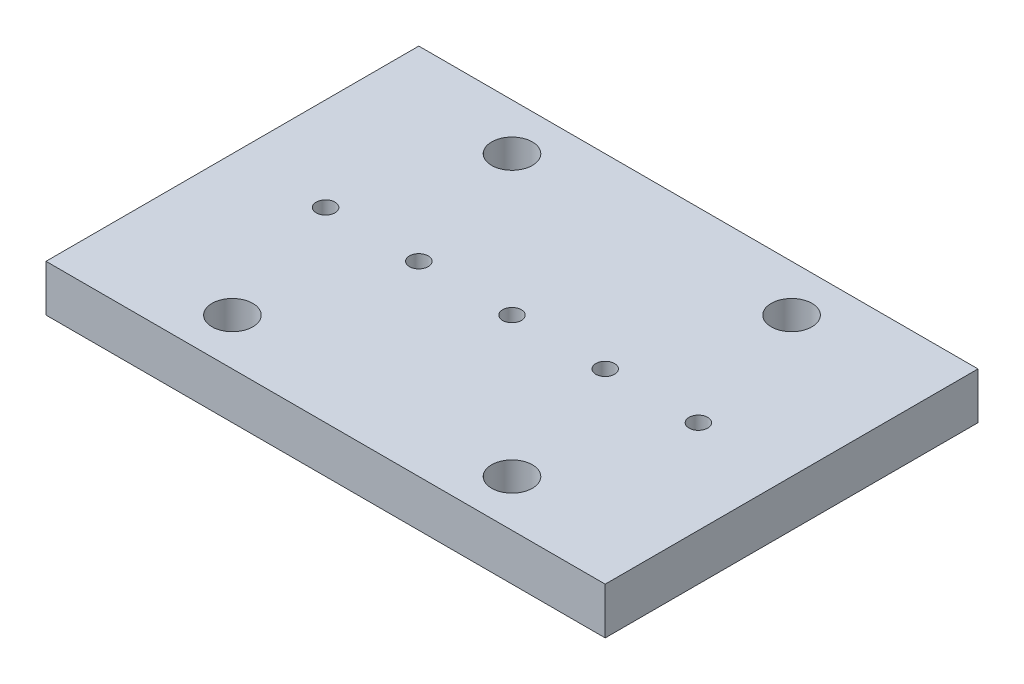
ISO-10303-21;
HEADER;
FILE_DESCRIPTION(('STEP AP214'),'2;1');
FILE_NAME('part.step','',(''),(''),'','','');
FILE_SCHEMA(('AUTOMOTIVE_DESIGN { 1 0 10303 214 1 1 1 1 }'));
ENDSEC;
DATA;
#1=APPLICATION_CONTEXT('core data for automotive mechanical design processes');
#2=APPLICATION_PROTOCOL_DEFINITION('international standard','automotive_design',2000,#1);
#3=PRODUCT_CONTEXT('',#1,'mechanical');
#4=PRODUCT('Part','Part','',(#3));
#5=PRODUCT_RELATED_PRODUCT_CATEGORY('part','',(#4));
#6=PRODUCT_DEFINITION_FORMATION('','',#4);
#7=PRODUCT_DEFINITION_CONTEXT('part definition',#1,'design');
#8=PRODUCT_DEFINITION('design','',#6,#7);
#9=PRODUCT_DEFINITION_SHAPE('','',#8);
#10=(LENGTH_UNIT() NAMED_UNIT(*) SI_UNIT(.MILLI.,.METRE.));
#11=(NAMED_UNIT(*) PLANE_ANGLE_UNIT() SI_UNIT($,.RADIAN.));
#12=(NAMED_UNIT(*) SI_UNIT($,.STERADIAN.) SOLID_ANGLE_UNIT());
#13=UNCERTAINTY_MEASURE_WITH_UNIT(LENGTH_MEASURE(1.E-05),#10,'distance_accuracy_value','');
#14=(GEOMETRIC_REPRESENTATION_CONTEXT(3) GLOBAL_UNCERTAINTY_ASSIGNED_CONTEXT((#13)) GLOBAL_UNIT_ASSIGNED_CONTEXT((#10,
#11,#12)) REPRESENTATION_CONTEXT('',''));
#15=CARTESIAN_POINT('',(0.,0.,0.));
#16=DIRECTION('',(0.,0.,1.));
#17=DIRECTION('',(1.,0.,0.));
#18=AXIS2_PLACEMENT_3D('',#15,#16,#17);
#19=CARTESIAN_POINT('',(0.,12.7,0.));
#20=DIRECTION('',(0.,-1.,0.));
#21=DIRECTION('',(0.,0.,-1.));
#22=AXIS2_PLACEMENT_3D('',#19,#20,#21);
#23=PLANE('',#22);
#24=CARTESIAN_POINT('',(25.4,12.7,0.));
#25=DIRECTION('',(0.,1.,0.));
#26=DIRECTION('',(0.,0.,1.));
#27=AXIS2_PLACEMENT_3D('',#24,#25,#26);
#28=CIRCLE('',#27,2.5527);
#29=CARTESIAN_POINT('',(25.4,12.7,2.5527));
#30=VERTEX_POINT('',#29);
#31=EDGE_CURVE('E179',#30,#30,#28,.T.);
#32=ORIENTED_EDGE('',*,*,#31,.F.);
#33=EDGE_LOOP('',(#32));
#34=FACE_BOUND('',#33,.T.);
#35=CARTESIAN_POINT('',(50.8,12.7,0.));
#36=DIRECTION('',(0.,1.,0.));
#37=DIRECTION('',(0.,0.,1.));
#38=AXIS2_PLACEMENT_3D('',#35,#36,#37);
#39=CIRCLE('',#38,2.5527);
#40=CARTESIAN_POINT('',(50.8,12.7,2.5527));
#41=VERTEX_POINT('',#40);
#42=EDGE_CURVE('E173',#41,#41,#39,.T.);
#43=ORIENTED_EDGE('',*,*,#42,.F.);
#44=EDGE_LOOP('',(#43));
#45=FACE_BOUND('',#44,.T.);
#46=CARTESIAN_POINT('',(-25.4,12.7,1.77367252013231E-13));
#47=DIRECTION('',(0.,1.,0.));
#48=DIRECTION('',(0.,0.,1.));
#49=AXIS2_PLACEMENT_3D('',#46,#47,#48);
#50=CIRCLE('',#49,2.5527);
#51=CARTESIAN_POINT('',(-25.4,12.7,2.55270000000018));
#52=VERTEX_POINT('',#51);
#53=EDGE_CURVE('E167',#52,#52,#50,.T.);
#54=ORIENTED_EDGE('',*,*,#53,.F.);
#55=EDGE_LOOP('',(#54));
#56=FACE_BOUND('',#55,.T.);
#57=CARTESIAN_POINT('',(-50.8,12.7,3.54734504026462E-13));
#58=DIRECTION('',(0.,1.,0.));
#59=DIRECTION('',(0.,0.,1.));
#60=AXIS2_PLACEMENT_3D('',#57,#58,#59);
#61=CIRCLE('',#60,2.5527);
#62=CARTESIAN_POINT('',(-50.8,12.7,2.55270000000035));
#63=VERTEX_POINT('',#62);
#64=EDGE_CURVE('E161',#63,#63,#61,.T.);
#65=ORIENTED_EDGE('',*,*,#64,.F.);
#66=EDGE_LOOP('',(#65));
#67=FACE_BOUND('',#66,.T.);
#68=CARTESIAN_POINT('',(-38.1,12.7,-38.1));
#69=DIRECTION('',(0.,1.,0.));
#70=DIRECTION('',(0.,0.,1.));
#71=AXIS2_PLACEMENT_3D('',#68,#69,#70);
#72=CIRCLE('',#71,5.55625);
#73=CARTESIAN_POINT('',(-38.1,12.7,-32.54375));
#74=VERTEX_POINT('',#73);
#75=EDGE_CURVE('E155',#74,#74,#72,.T.);
#76=ORIENTED_EDGE('',*,*,#75,.F.);
#77=EDGE_LOOP('',(#76));
#78=FACE_BOUND('',#77,.T.);
#79=CARTESIAN_POINT('',(38.1,12.7,-38.1));
#80=DIRECTION('',(0.,1.,0.));
#81=DIRECTION('',(0.,0.,1.));
#82=AXIS2_PLACEMENT_3D('',#79,#80,#81);
#83=CIRCLE('',#82,5.55625);
#84=CARTESIAN_POINT('',(38.1,12.7,-32.54375));
#85=VERTEX_POINT('',#84);
#86=EDGE_CURVE('E143',#85,#85,#83,.T.);
#87=ORIENTED_EDGE('',*,*,#86,.F.);
#88=EDGE_LOOP('',(#87));
#89=FACE_BOUND('',#88,.T.);
#90=CARTESIAN_POINT('',(38.1000000000008,12.7,38.1));
#91=DIRECTION('',(0.,1.,0.));
#92=DIRECTION('',(0.,0.,1.));
#93=AXIS2_PLACEMENT_3D('',#90,#91,#92);
#94=CIRCLE('',#93,5.55625);
#95=CARTESIAN_POINT('',(38.1000000000008,12.7,43.65625));
#96=VERTEX_POINT('',#95);
#97=EDGE_CURVE('E131',#96,#96,#94,.T.);
#98=ORIENTED_EDGE('',*,*,#97,.F.);
#99=EDGE_LOOP('',(#98));
#100=FACE_BOUND('',#99,.T.);
#101=CARTESIAN_POINT('',(-38.0999999999992,12.7,38.1));
#102=DIRECTION('',(0.,1.,0.));
#103=DIRECTION('',(0.,0.,1.));
#104=AXIS2_PLACEMENT_3D('',#101,#102,#103);
#105=CIRCLE('',#104,5.55625);
#106=CARTESIAN_POINT('',(-38.0999999999992,12.7,43.65625));
#107=VERTEX_POINT('',#106);
#108=EDGE_CURVE('E119',#107,#107,#105,.T.);
#109=ORIENTED_EDGE('',*,*,#108,.F.);
#110=EDGE_LOOP('',(#109));
#111=FACE_BOUND('',#110,.T.);
#112=DIRECTION('',(0.,0.,-1.));
#113=VECTOR('',#112,1.);
#114=CARTESIAN_POINT('',(76.2,12.7,50.8));
#115=LINE('',#114,#113);
#116=CARTESIAN_POINT('',(76.2,12.7,50.8));
#117=VERTEX_POINT('',#116);
#118=CARTESIAN_POINT('',(76.2,12.7,-50.8));
#119=VERTEX_POINT('',#118);
#120=EDGE_CURVE('E85',#117,#119,#115,.T.);
#121=ORIENTED_EDGE('',*,*,#120,.T.);
#122=DIRECTION('',(-1.,0.,0.));
#123=VECTOR('',#122,1.);
#124=CARTESIAN_POINT('',(-76.2,12.7,-50.8));
#125=LINE('',#124,#123);
#126=CARTESIAN_POINT('',(-76.2,12.7,-50.8));
#127=VERTEX_POINT('',#126);
#128=EDGE_CURVE('E80',#119,#127,#125,.T.);
#129=ORIENTED_EDGE('',*,*,#128,.T.);
#130=DIRECTION('',(0.,0.,1.));
#131=VECTOR('',#130,1.);
#132=CARTESIAN_POINT('',(-76.2,12.7,50.8));
#133=LINE('',#132,#131);
#134=CARTESIAN_POINT('',(-76.2,12.7,50.8));
#135=VERTEX_POINT('',#134);
#136=EDGE_CURVE('E83',#127,#135,#133,.T.);
#137=ORIENTED_EDGE('',*,*,#136,.T.);
#138=DIRECTION('',(1.,0.,0.));
#139=VECTOR('',#138,1.);
#140=CARTESIAN_POINT('',(-76.2,12.7,50.8));
#141=LINE('',#140,#139);
#142=EDGE_CURVE('E50',#135,#117,#141,.T.);
#143=ORIENTED_EDGE('',*,*,#142,.T.);
#144=EDGE_LOOP('',(#121,#129,#137,#143));
#145=FACE_BOUND('',#144,.T.);
#146=CARTESIAN_POINT('',(0.,12.7,0.));
#147=DIRECTION('',(0.,1.,0.));
#148=DIRECTION('',(0.,0.,1.));
#149=AXIS2_PLACEMENT_3D('',#146,#147,#148);
#150=CIRCLE('',#149,2.5527);
#151=CARTESIAN_POINT('',(0.,12.7,2.5527));
#152=VERTEX_POINT('',#151);
#153=EDGE_CURVE('E185',#152,#152,#150,.T.);
#154=ORIENTED_EDGE('',*,*,#153,.F.);
#155=EDGE_LOOP('',(#154));
#156=FACE_BOUND('',#155,.T.);
#157=ADVANCED_FACE('F33',(#34,#45,#56,#67,#78,#89,#100,#111,#145,#156),#23,.F.);
#158=CARTESIAN_POINT('',(76.2,12.7,50.8));
#159=DIRECTION('',(-1.,0.,0.));
#160=DIRECTION('',(0.,0.,1.));
#161=AXIS2_PLACEMENT_3D('',#158,#159,#160);
#162=PLANE('',#161);
#163=DIRECTION('',(0.,0.,-1.));
#164=VECTOR('',#163,1.);
#165=CARTESIAN_POINT('',(76.2,0.,50.8));
#166=LINE('',#165,#164);
#167=CARTESIAN_POINT('',(76.2,0.,50.8));
#168=VERTEX_POINT('',#167);
#169=CARTESIAN_POINT('',(76.2,0.,-50.8));
#170=VERTEX_POINT('',#169);
#171=EDGE_CURVE('E97',#168,#170,#166,.T.);
#172=ORIENTED_EDGE('',*,*,#171,.T.);
#173=DIRECTION('',(0.,-1.,0.));
#174=VECTOR('',#173,1.);
#175=CARTESIAN_POINT('',(76.2,12.7,-50.8));
#176=LINE('',#175,#174);
#177=EDGE_CURVE('E11',#119,#170,#176,.T.);
#178=ORIENTED_EDGE('',*,*,#177,.F.);
#179=ORIENTED_EDGE('',*,*,#120,.F.);
#180=DIRECTION('',(0.,-1.,0.));
#181=VECTOR('',#180,1.);
#182=CARTESIAN_POINT('',(76.2,12.7,50.8));
#183=LINE('',#182,#181);
#184=EDGE_CURVE('E93',#117,#168,#183,.T.);
#185=ORIENTED_EDGE('',*,*,#184,.T.);
#186=EDGE_LOOP('',(#172,#178,#179,#185));
#187=FACE_BOUND('',#186,.T.);
#188=ADVANCED_FACE('F35',(#187),#162,.F.);
#189=CARTESIAN_POINT('',(-76.2,12.7,-50.8));
#190=DIRECTION('',(0.,0.,1.));
#191=DIRECTION('',(1.,0.,0.));
#192=AXIS2_PLACEMENT_3D('',#189,#190,#191);
#193=PLANE('',#192);
#194=DIRECTION('',(-1.,0.,0.));
#195=VECTOR('',#194,1.);
#196=CARTESIAN_POINT('',(-76.2,0.,-50.8));
#197=LINE('',#196,#195);
#198=CARTESIAN_POINT('',(-76.2,0.,-50.8));
#199=VERTEX_POINT('',#198);
#200=EDGE_CURVE('E89',#170,#199,#197,.T.);
#201=ORIENTED_EDGE('',*,*,#200,.T.);
#202=DIRECTION('',(0.,-1.,0.));
#203=VECTOR('',#202,1.);
#204=CARTESIAN_POINT('',(-76.2,12.7,-50.8));
#205=LINE('',#204,#203);
#206=EDGE_CURVE('E42',#127,#199,#205,.T.);
#207=ORIENTED_EDGE('',*,*,#206,.F.);
#208=ORIENTED_EDGE('',*,*,#128,.F.);
#209=ORIENTED_EDGE('',*,*,#177,.T.);
#210=EDGE_LOOP('',(#201,#207,#208,#209));
#211=FACE_BOUND('',#210,.T.);
#212=ADVANCED_FACE('F88',(#211),#193,.F.);
#213=CARTESIAN_POINT('',(-76.2,12.7,50.8));
#214=DIRECTION('',(1.,0.,0.));
#215=DIRECTION('',(0.,0.,-1.));
#216=AXIS2_PLACEMENT_3D('',#213,#214,#215);
#217=PLANE('',#216);
#218=DIRECTION('',(0.,0.,1.));
#219=VECTOR('',#218,1.);
#220=CARTESIAN_POINT('',(-76.2,0.,50.8));
#221=LINE('',#220,#219);
#222=CARTESIAN_POINT('',(-76.2,0.,50.8));
#223=VERTEX_POINT('',#222);
#224=EDGE_CURVE('E67',#199,#223,#221,.T.);
#225=ORIENTED_EDGE('',*,*,#224,.T.);
#226=DIRECTION('',(0.,-1.,0.));
#227=VECTOR('',#226,1.);
#228=CARTESIAN_POINT('',(-76.2,12.7,50.8));
#229=LINE('',#228,#227);
#230=EDGE_CURVE('E90',#135,#223,#229,.T.);
#231=ORIENTED_EDGE('',*,*,#230,.F.);
#232=ORIENTED_EDGE('',*,*,#136,.F.);
#233=ORIENTED_EDGE('',*,*,#206,.T.);
#234=EDGE_LOOP('',(#225,#231,#232,#233));
#235=FACE_BOUND('',#234,.T.);
#236=ADVANCED_FACE('F91',(#235),#217,.F.);
#237=CARTESIAN_POINT('',(-76.2,12.7,50.8));
#238=DIRECTION('',(0.,0.,-1.));
#239=DIRECTION('',(-1.,0.,0.));
#240=AXIS2_PLACEMENT_3D('',#237,#238,#239);
#241=PLANE('',#240);
#242=DIRECTION('',(1.,0.,0.));
#243=VECTOR('',#242,1.);
#244=CARTESIAN_POINT('',(-76.2,0.,50.8));
#245=LINE('',#244,#243);
#246=EDGE_CURVE('E73',#223,#168,#245,.T.);
#247=ORIENTED_EDGE('',*,*,#246,.T.);
#248=ORIENTED_EDGE('',*,*,#184,.F.);
#249=ORIENTED_EDGE('',*,*,#142,.F.);
#250=ORIENTED_EDGE('',*,*,#230,.T.);
#251=EDGE_LOOP('',(#247,#248,#249,#250));
#252=FACE_BOUND('',#251,.T.);
#253=ADVANCED_FACE('F105',(#252),#241,.F.);
#254=CARTESIAN_POINT('',(0.,0.,0.));
#255=DIRECTION('',(0.,-1.,0.));
#256=DIRECTION('',(0.,0.,-1.));
#257=AXIS2_PLACEMENT_3D('',#254,#255,#256);
#258=PLANE('',#257);
#259=CARTESIAN_POINT('',(0.,0.,0.));
#260=DIRECTION('',(0.,1.,0.));
#261=DIRECTION('',(0.,0.,1.));
#262=AXIS2_PLACEMENT_3D('',#259,#260,#261);
#263=CIRCLE('',#262,2.5527);
#264=CARTESIAN_POINT('',(0.,0.,2.5527));
#265=VERTEX_POINT('',#264);
#266=EDGE_CURVE('E182',#265,#265,#263,.T.);
#267=ORIENTED_EDGE('',*,*,#266,.T.);
#268=EDGE_LOOP('',(#267));
#269=FACE_BOUND('',#268,.T.);
#270=CARTESIAN_POINT('',(25.4,0.,0.));
#271=DIRECTION('',(0.,1.,0.));
#272=DIRECTION('',(0.,0.,1.));
#273=AXIS2_PLACEMENT_3D('',#270,#271,#272);
#274=CIRCLE('',#273,2.5527);
#275=CARTESIAN_POINT('',(25.4,0.,2.5527));
#276=VERTEX_POINT('',#275);
#277=EDGE_CURVE('E176',#276,#276,#274,.T.);
#278=ORIENTED_EDGE('',*,*,#277,.T.);
#279=EDGE_LOOP('',(#278));
#280=FACE_BOUND('',#279,.T.);
#281=CARTESIAN_POINT('',(50.8,0.,0.));
#282=DIRECTION('',(0.,1.,0.));
#283=DIRECTION('',(0.,0.,1.));
#284=AXIS2_PLACEMENT_3D('',#281,#282,#283);
#285=CIRCLE('',#284,2.5527);
#286=CARTESIAN_POINT('',(50.8,0.,2.5527));
#287=VERTEX_POINT('',#286);
#288=EDGE_CURVE('E170',#287,#287,#285,.T.);
#289=ORIENTED_EDGE('',*,*,#288,.T.);
#290=EDGE_LOOP('',(#289));
#291=FACE_BOUND('',#290,.T.);
#292=CARTESIAN_POINT('',(-25.4,0.,1.77367252013231E-13));
#293=DIRECTION('',(0.,1.,0.));
#294=DIRECTION('',(0.,0.,1.));
#295=AXIS2_PLACEMENT_3D('',#292,#293,#294);
#296=CIRCLE('',#295,2.5527);
#297=CARTESIAN_POINT('',(-25.4,0.,2.55270000000018));
#298=VERTEX_POINT('',#297);
#299=EDGE_CURVE('E164',#298,#298,#296,.T.);
#300=ORIENTED_EDGE('',*,*,#299,.T.);
#301=EDGE_LOOP('',(#300));
#302=FACE_BOUND('',#301,.T.);
#303=CARTESIAN_POINT('',(-50.8,0.,3.54734504026462E-13));
#304=DIRECTION('',(0.,1.,0.));
#305=DIRECTION('',(0.,0.,1.));
#306=AXIS2_PLACEMENT_3D('',#303,#304,#305);
#307=CIRCLE('',#306,2.5527);
#308=CARTESIAN_POINT('',(-50.8,0.,2.55270000000035));
#309=VERTEX_POINT('',#308);
#310=EDGE_CURVE('E158',#309,#309,#307,.T.);
#311=ORIENTED_EDGE('',*,*,#310,.T.);
#312=EDGE_LOOP('',(#311));
#313=FACE_BOUND('',#312,.T.);
#314=CARTESIAN_POINT('',(-38.1,0.,-38.1));
#315=DIRECTION('',(0.,1.,0.));
#316=DIRECTION('',(0.,0.,1.));
#317=AXIS2_PLACEMENT_3D('',#314,#315,#316);
#318=CIRCLE('',#317,3.57124);
#319=CARTESIAN_POINT('',(-38.1,0.,-34.52876));
#320=VERTEX_POINT('',#319);
#321=EDGE_CURVE('E146',#320,#320,#318,.T.);
#322=ORIENTED_EDGE('',*,*,#321,.T.);
#323=EDGE_LOOP('',(#322));
#324=FACE_BOUND('',#323,.T.);
#325=CARTESIAN_POINT('',(38.1,0.,-38.1));
#326=DIRECTION('',(0.,1.,0.));
#327=DIRECTION('',(0.,0.,1.));
#328=AXIS2_PLACEMENT_3D('',#325,#326,#327);
#329=CIRCLE('',#328,3.57124);
#330=CARTESIAN_POINT('',(38.1,0.,-34.52876));
#331=VERTEX_POINT('',#330);
#332=EDGE_CURVE('E134',#331,#331,#329,.T.);
#333=ORIENTED_EDGE('',*,*,#332,.T.);
#334=EDGE_LOOP('',(#333));
#335=FACE_BOUND('',#334,.T.);
#336=CARTESIAN_POINT('',(38.1000000000008,0.,38.1));
#337=DIRECTION('',(0.,1.,0.));
#338=DIRECTION('',(0.,0.,1.));
#339=AXIS2_PLACEMENT_3D('',#336,#337,#338);
#340=CIRCLE('',#339,3.57124);
#341=CARTESIAN_POINT('',(38.1000000000008,0.,41.67124));
#342=VERTEX_POINT('',#341);
#343=EDGE_CURVE('E122',#342,#342,#340,.T.);
#344=ORIENTED_EDGE('',*,*,#343,.T.);
#345=EDGE_LOOP('',(#344));
#346=FACE_BOUND('',#345,.T.);
#347=CARTESIAN_POINT('',(-38.0999999999992,0.,38.1));
#348=DIRECTION('',(0.,1.,0.));
#349=DIRECTION('',(0.,0.,1.));
#350=AXIS2_PLACEMENT_3D('',#347,#348,#349);
#351=CIRCLE('',#350,3.57124);
#352=CARTESIAN_POINT('',(-38.0999999999992,0.,41.67124));
#353=VERTEX_POINT('',#352);
#354=EDGE_CURVE('E100',#353,#353,#351,.T.);
#355=ORIENTED_EDGE('',*,*,#354,.T.);
#356=EDGE_LOOP('',(#355));
#357=FACE_BOUND('',#356,.T.);
#358=ORIENTED_EDGE('',*,*,#171,.F.);
#359=ORIENTED_EDGE('',*,*,#246,.F.);
#360=ORIENTED_EDGE('',*,*,#224,.F.);
#361=ORIENTED_EDGE('',*,*,#200,.F.);
#362=EDGE_LOOP('',(#358,#359,#360,#361));
#363=FACE_BOUND('',#362,.T.);
#364=ADVANCED_FACE('F108',(#269,#280,#291,#302,#313,#324,#335,#346,#357,#363),#258,.T.);
#365=CARTESIAN_POINT('',(-38.0999999999992,12.7,38.1));
#366=DIRECTION('',(0.,1.,0.));
#367=DIRECTION('',(0.,0.,1.));
#368=AXIS2_PLACEMENT_3D('',#365,#366,#367);
#369=CYLINDRICAL_SURFACE('',#368,3.57124);
#370=ORIENTED_EDGE('',*,*,#354,.F.);
#371=EDGE_LOOP('',(#370));
#372=FACE_BOUND('',#371,.T.);
#373=CARTESIAN_POINT('',(-38.0999999999992,3.81,38.1));
#374=DIRECTION('',(0.,1.,0.));
#375=DIRECTION('',(0.,0.,1.));
#376=AXIS2_PLACEMENT_3D('',#373,#374,#375);
#377=CIRCLE('',#376,3.57124);
#378=CARTESIAN_POINT('',(-38.0999999999992,3.81,41.67124));
#379=VERTEX_POINT('',#378);
#380=EDGE_CURVE('E113',#379,#379,#377,.T.);
#381=ORIENTED_EDGE('',*,*,#380,.T.);
#382=EDGE_LOOP('',(#381));
#383=FACE_BOUND('',#382,.T.);
#384=ADVANCED_FACE('F200',(#372,#383),#369,.F.);
#385=CARTESIAN_POINT('',(-34.5287599999992,3.81,38.1));
#386=DIRECTION('',(0.,-1.,0.));
#387=DIRECTION('',(0.,0.,-1.));
#388=AXIS2_PLACEMENT_3D('',#385,#386,#387);
#389=PLANE('',#388);
#390=ORIENTED_EDGE('',*,*,#380,.F.);
#391=EDGE_LOOP('',(#390));
#392=FACE_BOUND('',#391,.T.);
#393=CARTESIAN_POINT('',(-38.0999999999992,3.81,38.1));
#394=DIRECTION('',(0.,1.,0.));
#395=DIRECTION('',(0.,0.,1.));
#396=AXIS2_PLACEMENT_3D('',#393,#394,#395);
#397=CIRCLE('',#396,5.55625);
#398=CARTESIAN_POINT('',(-38.0999999999992,3.81,43.65625));
#399=VERTEX_POINT('',#398);
#400=EDGE_CURVE('E116',#399,#399,#397,.T.);
#401=ORIENTED_EDGE('',*,*,#400,.T.);
#402=EDGE_LOOP('',(#401));
#403=FACE_BOUND('',#402,.T.);
#404=ADVANCED_FACE('F232',(#392,#403),#389,.F.);
#405=CARTESIAN_POINT('',(-38.0999999999992,12.7,38.1));
#406=DIRECTION('',(0.,1.,0.));
#407=DIRECTION('',(0.,0.,1.));
#408=AXIS2_PLACEMENT_3D('',#405,#406,#407);
#409=CYLINDRICAL_SURFACE('',#408,5.55625);
#410=ORIENTED_EDGE('',*,*,#400,.F.);
#411=EDGE_LOOP('',(#410));
#412=FACE_BOUND('',#411,.T.);
#413=ORIENTED_EDGE('',*,*,#108,.T.);
#414=EDGE_LOOP('',(#413));
#415=FACE_BOUND('',#414,.T.);
#416=ADVANCED_FACE('F239',(#412,#415),#409,.F.);
#417=CARTESIAN_POINT('',(38.1000000000008,12.7,38.1));
#418=DIRECTION('',(0.,1.,0.));
#419=DIRECTION('',(0.,0.,1.));
#420=AXIS2_PLACEMENT_3D('',#417,#418,#419);
#421=CYLINDRICAL_SURFACE('',#420,3.57124);
#422=ORIENTED_EDGE('',*,*,#343,.F.);
#423=EDGE_LOOP('',(#422));
#424=FACE_BOUND('',#423,.T.);
#425=CARTESIAN_POINT('',(38.1000000000008,3.81,38.1));
#426=DIRECTION('',(0.,1.,0.));
#427=DIRECTION('',(0.,0.,1.));
#428=AXIS2_PLACEMENT_3D('',#425,#426,#427);
#429=CIRCLE('',#428,3.57124);
#430=CARTESIAN_POINT('',(38.1000000000008,3.81,41.67124));
#431=VERTEX_POINT('',#430);
#432=EDGE_CURVE('E125',#431,#431,#429,.T.);
#433=ORIENTED_EDGE('',*,*,#432,.T.);
#434=EDGE_LOOP('',(#433));
#435=FACE_BOUND('',#434,.T.);
#436=ADVANCED_FACE('F246',(#424,#435),#421,.F.);
#437=CARTESIAN_POINT('',(41.6712400000008,3.81,38.1));
#438=DIRECTION('',(0.,-1.,0.));
#439=DIRECTION('',(0.,0.,-1.));
#440=AXIS2_PLACEMENT_3D('',#437,#438,#439);
#441=PLANE('',#440);
#442=ORIENTED_EDGE('',*,*,#432,.F.);
#443=EDGE_LOOP('',(#442));
#444=FACE_BOUND('',#443,.T.);
#445=CARTESIAN_POINT('',(38.1000000000008,3.81,38.1));
#446=DIRECTION('',(0.,1.,0.));
#447=DIRECTION('',(0.,0.,1.));
#448=AXIS2_PLACEMENT_3D('',#445,#446,#447);
#449=CIRCLE('',#448,5.55625);
#450=CARTESIAN_POINT('',(38.1000000000008,3.81,43.65625));
#451=VERTEX_POINT('',#450);
#452=EDGE_CURVE('E128',#451,#451,#449,.T.);
#453=ORIENTED_EDGE('',*,*,#452,.T.);
#454=EDGE_LOOP('',(#453));
#455=FACE_BOUND('',#454,.T.);
#456=ADVANCED_FACE('F254',(#444,#455),#441,.F.);
#457=CARTESIAN_POINT('',(38.1000000000008,12.7,38.1));
#458=DIRECTION('',(0.,1.,0.));
#459=DIRECTION('',(0.,0.,1.));
#460=AXIS2_PLACEMENT_3D('',#457,#458,#459);
#461=CYLINDRICAL_SURFACE('',#460,5.55625);
#462=ORIENTED_EDGE('',*,*,#452,.F.);
#463=EDGE_LOOP('',(#462));
#464=FACE_BOUND('',#463,.T.);
#465=ORIENTED_EDGE('',*,*,#97,.T.);
#466=EDGE_LOOP('',(#465));
#467=FACE_BOUND('',#466,.T.);
#468=ADVANCED_FACE('F262',(#464,#467),#461,.F.);
#469=CARTESIAN_POINT('',(38.1,12.7,-38.1));
#470=DIRECTION('',(0.,1.,0.));
#471=DIRECTION('',(0.,0.,1.));
#472=AXIS2_PLACEMENT_3D('',#469,#470,#471);
#473=CYLINDRICAL_SURFACE('',#472,3.57124);
#474=ORIENTED_EDGE('',*,*,#332,.F.);
#475=EDGE_LOOP('',(#474));
#476=FACE_BOUND('',#475,.T.);
#477=CARTESIAN_POINT('',(38.1,3.81,-38.1));
#478=DIRECTION('',(0.,1.,0.));
#479=DIRECTION('',(0.,0.,1.));
#480=AXIS2_PLACEMENT_3D('',#477,#478,#479);
#481=CIRCLE('',#480,3.57124);
#482=CARTESIAN_POINT('',(38.1,3.81,-34.52876));
#483=VERTEX_POINT('',#482);
#484=EDGE_CURVE('E137',#483,#483,#481,.T.);
#485=ORIENTED_EDGE('',*,*,#484,.T.);
#486=EDGE_LOOP('',(#485));
#487=FACE_BOUND('',#486,.T.);
#488=ADVANCED_FACE('F270',(#476,#487),#473,.F.);
#489=CARTESIAN_POINT('',(41.67124,3.81,-38.1));
#490=DIRECTION('',(0.,-1.,0.));
#491=DIRECTION('',(0.,0.,-1.));
#492=AXIS2_PLACEMENT_3D('',#489,#490,#491);
#493=PLANE('',#492);
#494=ORIENTED_EDGE('',*,*,#484,.F.);
#495=EDGE_LOOP('',(#494));
#496=FACE_BOUND('',#495,.T.);
#497=CARTESIAN_POINT('',(38.1,3.81,-38.1));
#498=DIRECTION('',(0.,1.,0.));
#499=DIRECTION('',(0.,0.,1.));
#500=AXIS2_PLACEMENT_3D('',#497,#498,#499);
#501=CIRCLE('',#500,5.55625);
#502=CARTESIAN_POINT('',(38.1,3.81,-32.54375));
#503=VERTEX_POINT('',#502);
#504=EDGE_CURVE('E140',#503,#503,#501,.T.);
#505=ORIENTED_EDGE('',*,*,#504,.T.);
#506=EDGE_LOOP('',(#505));
#507=FACE_BOUND('',#506,.T.);
#508=ADVANCED_FACE('F278',(#496,#507),#493,.F.);
#509=CARTESIAN_POINT('',(38.1,12.7,-38.1));
#510=DIRECTION('',(0.,1.,0.));
#511=DIRECTION('',(0.,0.,1.));
#512=AXIS2_PLACEMENT_3D('',#509,#510,#511);
#513=CYLINDRICAL_SURFACE('',#512,5.55625);
#514=ORIENTED_EDGE('',*,*,#504,.F.);
#515=EDGE_LOOP('',(#514));
#516=FACE_BOUND('',#515,.T.);
#517=ORIENTED_EDGE('',*,*,#86,.T.);
#518=EDGE_LOOP('',(#517));
#519=FACE_BOUND('',#518,.T.);
#520=ADVANCED_FACE('F286',(#516,#519),#513,.F.);
#521=CARTESIAN_POINT('',(-38.1,12.7,-38.1));
#522=DIRECTION('',(0.,1.,0.));
#523=DIRECTION('',(0.,0.,1.));
#524=AXIS2_PLACEMENT_3D('',#521,#522,#523);
#525=CYLINDRICAL_SURFACE('',#524,3.57124);
#526=ORIENTED_EDGE('',*,*,#321,.F.);
#527=EDGE_LOOP('',(#526));
#528=FACE_BOUND('',#527,.T.);
#529=CARTESIAN_POINT('',(-38.1,3.81,-38.1));
#530=DIRECTION('',(0.,1.,0.));
#531=DIRECTION('',(0.,0.,1.));
#532=AXIS2_PLACEMENT_3D('',#529,#530,#531);
#533=CIRCLE('',#532,3.57124);
#534=CARTESIAN_POINT('',(-38.1,3.81,-34.52876));
#535=VERTEX_POINT('',#534);
#536=EDGE_CURVE('E149',#535,#535,#533,.T.);
#537=ORIENTED_EDGE('',*,*,#536,.T.);
#538=EDGE_LOOP('',(#537));
#539=FACE_BOUND('',#538,.T.);
#540=ADVANCED_FACE('F294',(#528,#539),#525,.F.);
#541=CARTESIAN_POINT('',(-34.52876,3.81,-38.1));
#542=DIRECTION('',(0.,-1.,0.));
#543=DIRECTION('',(0.,0.,-1.));
#544=AXIS2_PLACEMENT_3D('',#541,#542,#543);
#545=PLANE('',#544);
#546=ORIENTED_EDGE('',*,*,#536,.F.);
#547=EDGE_LOOP('',(#546));
#548=FACE_BOUND('',#547,.T.);
#549=CARTESIAN_POINT('',(-38.1,3.81,-38.1));
#550=DIRECTION('',(0.,1.,0.));
#551=DIRECTION('',(0.,0.,1.));
#552=AXIS2_PLACEMENT_3D('',#549,#550,#551);
#553=CIRCLE('',#552,5.55625);
#554=CARTESIAN_POINT('',(-38.1,3.81,-32.54375));
#555=VERTEX_POINT('',#554);
#556=EDGE_CURVE('E152',#555,#555,#553,.T.);
#557=ORIENTED_EDGE('',*,*,#556,.T.);
#558=EDGE_LOOP('',(#557));
#559=FACE_BOUND('',#558,.T.);
#560=ADVANCED_FACE('F302',(#548,#559),#545,.F.);
#561=CARTESIAN_POINT('',(-38.1,12.7,-38.1));
#562=DIRECTION('',(0.,1.,0.));
#563=DIRECTION('',(0.,0.,1.));
#564=AXIS2_PLACEMENT_3D('',#561,#562,#563);
#565=CYLINDRICAL_SURFACE('',#564,5.55625);
#566=ORIENTED_EDGE('',*,*,#556,.F.);
#567=EDGE_LOOP('',(#566));
#568=FACE_BOUND('',#567,.T.);
#569=ORIENTED_EDGE('',*,*,#75,.T.);
#570=EDGE_LOOP('',(#569));
#571=FACE_BOUND('',#570,.T.);
#572=ADVANCED_FACE('F310',(#568,#571),#565,.F.);
#573=CARTESIAN_POINT('',(-50.8,12.7,3.54734504026462E-13));
#574=DIRECTION('',(0.,1.,0.));
#575=DIRECTION('',(0.,0.,1.));
#576=AXIS2_PLACEMENT_3D('',#573,#574,#575);
#577=CYLINDRICAL_SURFACE('',#576,2.5527);
#578=ORIENTED_EDGE('',*,*,#310,.F.);
#579=EDGE_LOOP('',(#578));
#580=FACE_BOUND('',#579,.T.);
#581=ORIENTED_EDGE('',*,*,#64,.T.);
#582=EDGE_LOOP('',(#581));
#583=FACE_BOUND('',#582,.T.);
#584=ADVANCED_FACE('F318',(#580,#583),#577,.F.);
#585=CARTESIAN_POINT('',(-25.4,12.7,1.77367252013231E-13));
#586=DIRECTION('',(0.,1.,0.));
#587=DIRECTION('',(0.,0.,1.));
#588=AXIS2_PLACEMENT_3D('',#585,#586,#587);
#589=CYLINDRICAL_SURFACE('',#588,2.5527);
#590=ORIENTED_EDGE('',*,*,#299,.F.);
#591=EDGE_LOOP('',(#590));
#592=FACE_BOUND('',#591,.T.);
#593=ORIENTED_EDGE('',*,*,#53,.T.);
#594=EDGE_LOOP('',(#593));
#595=FACE_BOUND('',#594,.T.);
#596=ADVANCED_FACE('F325',(#592,#595),#589,.F.);
#597=CARTESIAN_POINT('',(50.8,12.7,0.));
#598=DIRECTION('',(0.,1.,0.));
#599=DIRECTION('',(0.,0.,1.));
#600=AXIS2_PLACEMENT_3D('',#597,#598,#599);
#601=CYLINDRICAL_SURFACE('',#600,2.5527);
#602=ORIENTED_EDGE('',*,*,#288,.F.);
#603=EDGE_LOOP('',(#602));
#604=FACE_BOUND('',#603,.T.);
#605=ORIENTED_EDGE('',*,*,#42,.T.);
#606=EDGE_LOOP('',(#605));
#607=FACE_BOUND('',#606,.T.);
#608=ADVANCED_FACE('F333',(#604,#607),#601,.F.);
#609=CARTESIAN_POINT('',(25.4,12.7,0.));
#610=DIRECTION('',(0.,1.,0.));
#611=DIRECTION('',(0.,0.,1.));
#612=AXIS2_PLACEMENT_3D('',#609,#610,#611);
#613=CYLINDRICAL_SURFACE('',#612,2.5527);
#614=ORIENTED_EDGE('',*,*,#277,.F.);
#615=EDGE_LOOP('',(#614));
#616=FACE_BOUND('',#615,.T.);
#617=ORIENTED_EDGE('',*,*,#31,.T.);
#618=EDGE_LOOP('',(#617));
#619=FACE_BOUND('',#618,.T.);
#620=ADVANCED_FACE('F341',(#616,#619),#613,.F.);
#621=CARTESIAN_POINT('',(0.,12.7,0.));
#622=DIRECTION('',(0.,1.,0.));
#623=DIRECTION('',(0.,0.,1.));
#624=AXIS2_PLACEMENT_3D('',#621,#622,#623);
#625=CYLINDRICAL_SURFACE('',#624,2.5527);
#626=ORIENTED_EDGE('',*,*,#266,.F.);
#627=EDGE_LOOP('',(#626));
#628=FACE_BOUND('',#627,.T.);
#629=ORIENTED_EDGE('',*,*,#153,.T.);
#630=EDGE_LOOP('',(#629));
#631=FACE_BOUND('',#630,.T.);
#632=ADVANCED_FACE('F189',(#628,#631),#625,.F.);
#633=CLOSED_SHELL('',(#157,#188,#212,#236,#253,#364,#384,#404,#416,#436,#456,#468,#488,#508,
#520,#540,#560,#572,#584,#596,#608,#620,#632));
#634=MANIFOLD_SOLID_BREP('B2',#633);
#635=ADVANCED_BREP_SHAPE_REPRESENTATION('',(#18,#634),#14);
#636=SHAPE_DEFINITION_REPRESENTATION(#9,#635);
ENDSEC;
END-ISO-10303-21;
